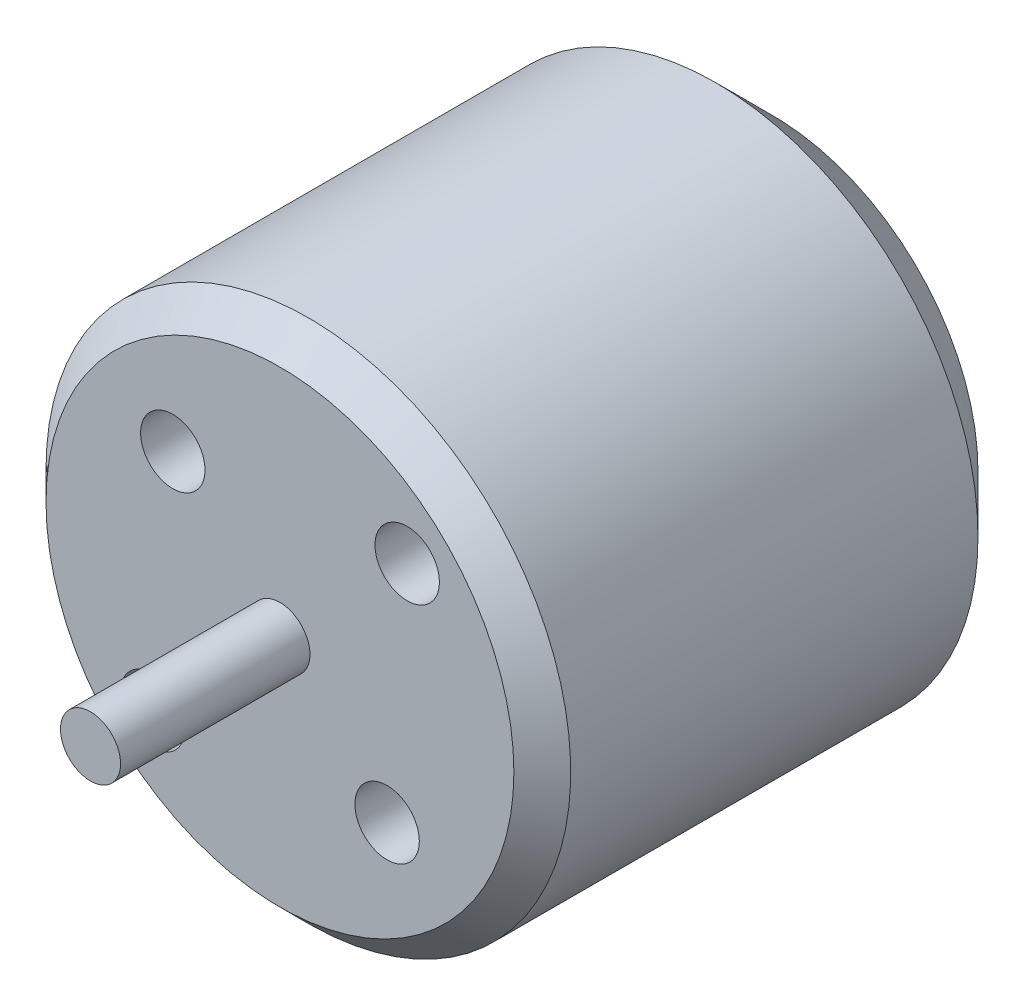
ISO-10303-21;
HEADER;
FILE_DESCRIPTION(('STEP AP214'),'2;1');
FILE_NAME('part.step','',(''),(''),'','','');
FILE_SCHEMA(('AUTOMOTIVE_DESIGN { 1 0 10303 214 1 1 1 1 }'));
ENDSEC;
DATA;
#1=APPLICATION_CONTEXT('core data for automotive mechanical design processes');
#2=APPLICATION_PROTOCOL_DEFINITION('international standard','automotive_design',2000,#1);
#3=PRODUCT_CONTEXT('',#1,'mechanical');
#4=PRODUCT('Part','Part','',(#3));
#5=PRODUCT_RELATED_PRODUCT_CATEGORY('part','',(#4));
#6=PRODUCT_DEFINITION_FORMATION('','',#4);
#7=PRODUCT_DEFINITION_CONTEXT('part definition',#1,'design');
#8=PRODUCT_DEFINITION('design','',#6,#7);
#9=PRODUCT_DEFINITION_SHAPE('','',#8);
#10=(LENGTH_UNIT() NAMED_UNIT(*) SI_UNIT(.MILLI.,.METRE.));
#11=(NAMED_UNIT(*) PLANE_ANGLE_UNIT() SI_UNIT($,.RADIAN.));
#12=(NAMED_UNIT(*) SI_UNIT($,.STERADIAN.) SOLID_ANGLE_UNIT());
#13=UNCERTAINTY_MEASURE_WITH_UNIT(LENGTH_MEASURE(1.E-05),#10,'distance_accuracy_value','');
#14=(GEOMETRIC_REPRESENTATION_CONTEXT(3) GLOBAL_UNCERTAINTY_ASSIGNED_CONTEXT((#13)) GLOBAL_UNIT_ASSIGNED_CONTEXT((#10,
#11,#12)) REPRESENTATION_CONTEXT('',''));
#15=CARTESIAN_POINT('',(0.,0.,0.));
#16=DIRECTION('',(0.,0.,1.));
#17=DIRECTION('',(1.,0.,0.));
#18=AXIS2_PLACEMENT_3D('',#15,#16,#17);
#19=CARTESIAN_POINT('',(0.,0.,26.));
#20=DIRECTION('',(0.,0.,-1.));
#21=DIRECTION('',(-1.,0.,0.));
#22=AXIS2_PLACEMENT_3D('',#19,#20,#21);
#23=CYLINDRICAL_SURFACE('',#22,13.85);
#24=CARTESIAN_POINT('',(0.,0.,3.00000000000001));
#25=DIRECTION('',(0.,0.,1.));
#26=DIRECTION('',(1.,0.,0.));
#27=AXIS2_PLACEMENT_3D('',#24,#25,#26);
#28=CIRCLE('',#27,13.85);
#29=CARTESIAN_POINT('',(-13.85,0.,3.00000000000001));
#30=VERTEX_POINT('',#29);
#31=EDGE_CURVE('E134',#30,#30,#28,.T.);
#32=CARTESIAN_POINT('',(0.,0.,24.5));
#33=DIRECTION('',(0.,0.,1.));
#34=DIRECTION('',(1.,0.,0.));
#35=AXIS2_PLACEMENT_3D('',#32,#33,#34);
#36=CIRCLE('',#35,13.85);
#37=CARTESIAN_POINT('',(-13.85,0.,24.5));
#38=VERTEX_POINT('',#37);
#39=EDGE_CURVE('E132',#38,#38,#36,.F.);
#40=CARTESIAN_POINT('',(-13.85,0.,3.00000000000001));
#41=CARTESIAN_POINT('',(-13.85,0.,3.22395833333334));
#42=CARTESIAN_POINT('',(-13.85,0.,3.44791666666668));
#43=CARTESIAN_POINT('',(-13.85,0.,3.89583333333335));
#44=CARTESIAN_POINT('',(-13.85,0.,4.11979166666668));
#45=CARTESIAN_POINT('',(-13.85,0.,4.56770833333334));
#46=CARTESIAN_POINT('',(-13.85,0.,4.79166666666668));
#47=CARTESIAN_POINT('',(-13.85,0.,5.23958333333335));
#48=CARTESIAN_POINT('',(-13.85,0.,5.46354166666668));
#49=CARTESIAN_POINT('',(-13.85,0.,5.91145833333335));
#50=CARTESIAN_POINT('',(-13.85,0.,6.13541666666668));
#51=CARTESIAN_POINT('',(-13.85,0.,6.58333333333335));
#52=CARTESIAN_POINT('',(-13.85,0.,6.80729166666668));
#53=CARTESIAN_POINT('',(-13.85,0.,7.25520833333335));
#54=CARTESIAN_POINT('',(-13.85,0.,7.47916666666668));
#55=CARTESIAN_POINT('',(-13.85,0.,7.92708333333335));
#56=CARTESIAN_POINT('',(-13.85,0.,8.15104166666669));
#57=CARTESIAN_POINT('',(-13.85,0.,8.59895833333335));
#58=CARTESIAN_POINT('',(-13.85,0.,8.82291666666668));
#59=CARTESIAN_POINT('',(-13.85,0.,9.27083333333335));
#60=CARTESIAN_POINT('',(-13.85,0.,9.49479166666668));
#61=CARTESIAN_POINT('',(-13.85,0.,9.94270833333335));
#62=CARTESIAN_POINT('',(-13.85,0.,10.1666666666667));
#63=CARTESIAN_POINT('',(-13.85,0.,10.6145833333334));
#64=CARTESIAN_POINT('',(-13.85,0.,10.8385416666667));
#65=CARTESIAN_POINT('',(-13.85,0.,11.2864583333334));
#66=CARTESIAN_POINT('',(-13.85,0.,11.5104166666667));
#67=CARTESIAN_POINT('',(-13.85,0.,11.9583333333334));
#68=CARTESIAN_POINT('',(-13.85,0.,12.1822916666667));
#69=CARTESIAN_POINT('',(-13.85,0.,12.6302083333334));
#70=CARTESIAN_POINT('',(-13.85,0.,12.8541666666667));
#71=CARTESIAN_POINT('',(-13.85,0.,13.3020833333334));
#72=CARTESIAN_POINT('',(-13.85,0.,13.5260416666667));
#73=CARTESIAN_POINT('',(-13.85,0.,13.9739583333334));
#74=CARTESIAN_POINT('',(-13.85,0.,14.1979166666667));
#75=CARTESIAN_POINT('',(-13.85,0.,14.6458333333334));
#76=CARTESIAN_POINT('',(-13.85,0.,14.8697916666667));
#77=CARTESIAN_POINT('',(-13.85,0.,15.3177083333334));
#78=CARTESIAN_POINT('',(-13.85,0.,15.5416666666667));
#79=CARTESIAN_POINT('',(-13.85,0.,15.9895833333334));
#80=CARTESIAN_POINT('',(-13.85,0.,16.2135416666667));
#81=CARTESIAN_POINT('',(-13.85,0.,16.6614583333334));
#82=CARTESIAN_POINT('',(-13.85,0.,16.8854166666667));
#83=CARTESIAN_POINT('',(-13.85,0.,17.3333333333334));
#84=CARTESIAN_POINT('',(-13.85,0.,17.5572916666667));
#85=CARTESIAN_POINT('',(-13.85,0.,18.0052083333334));
#86=CARTESIAN_POINT('',(-13.85,0.,18.2291666666667));
#87=CARTESIAN_POINT('',(-13.85,0.,18.6770833333334));
#88=CARTESIAN_POINT('',(-13.85,0.,18.9010416666667));
#89=CARTESIAN_POINT('',(-13.85,0.,19.3489583333334));
#90=CARTESIAN_POINT('',(-13.85,0.,19.5729166666667));
#91=CARTESIAN_POINT('',(-13.85,0.,20.0208333333334));
#92=CARTESIAN_POINT('',(-13.85,0.,20.2447916666667));
#93=CARTESIAN_POINT('',(-13.85,0.,20.6927083333334));
#94=CARTESIAN_POINT('',(-13.85,0.,20.9166666666667));
#95=CARTESIAN_POINT('',(-13.85,0.,21.3645833333334));
#96=CARTESIAN_POINT('',(-13.85,0.,21.5885416666667));
#97=CARTESIAN_POINT('',(-13.85,0.,22.0364583333334));
#98=CARTESIAN_POINT('',(-13.85,0.,22.2604166666667));
#99=CARTESIAN_POINT('',(-13.85,0.,22.7083333333334));
#100=CARTESIAN_POINT('',(-13.85,0.,22.9322916666667));
#101=CARTESIAN_POINT('',(-13.85,0.,23.3802083333334));
#102=CARTESIAN_POINT('',(-13.85,0.,23.6041666666667));
#103=CARTESIAN_POINT('',(-13.85,0.,24.0520833333334));
#104=CARTESIAN_POINT('',(-13.85,0.,24.2760416666667));
#105=CARTESIAN_POINT('',(-13.85,0.,24.5));
#106=B_SPLINE_CURVE_WITH_KNOTS('',3,(#40,#41,#42,#43,#44,#45,#46,#47,#48,#49,#50,#51,#52,#53,
#54,#55,#56,#57,#58,#59,#60,#61,#62,#63,#64,#65,#66,#67,#68,#69,#70,#71,#72,#73,#74,#75,#76,#77,
#78,#79,#80,#81,#82,#83,#84,#85,#86,#87,#88,#89,#90,#91,#92,#93,#94,#95,#96,#97,#98,#99,#100,
#101,#102,#103,#104,#105),.UNSPECIFIED.,.F.,.F.,(4,2,2,2,2,2,2,2,2,2,2,2,2,2,2,2,2,2,2,2,2,2,2,
2,2,2,2,2,2,2,2,2,4),(0.,0.671875000000002,1.34375,2.015625,2.6875,3.359375,4.03125000000001,
4.70312500000001,5.37500000000001,6.04687500000001,6.71875000000001,7.39062500000001,
8.06250000000001,8.73437500000001,9.40625000000001,10.078125,10.75,11.421875,12.09375,12.765625,
13.4375,14.109375,14.78125,15.453125,16.125,16.796875,17.46875,18.140625,18.8125,19.484375,
20.15625,20.828125,21.5),.UNSPECIFIED.);
#107=EDGE_CURVE('BSEAM37',#30,#38,#106,.T.);
#108=ORIENTED_EDGE('',*,*,#31,.T.);
#109=ORIENTED_EDGE('',*,*,#39,.T.);
#110=ORIENTED_EDGE('',*,*,#107,.T.);
#111=ORIENTED_EDGE('',*,*,#107,.F.);
#112=EDGE_LOOP('',(#108,#110,#109,#111));
#113=FACE_BOUND('',#112,.T.);
#114=ADVANCED_FACE('F37',(#113),#23,.T.);
#115=CARTESIAN_POINT('',(0.,0.,26.));
#116=DIRECTION('',(0.,0.,1.));
#117=DIRECTION('',(1.,0.,0.));
#118=AXIS2_PLACEMENT_3D('',#115,#116,#117);
#119=PLANE('',#118);
#120=CARTESIAN_POINT('',(-5.65685424949237,5.65685424949239,26.));
#121=DIRECTION('',(0.,0.,1.));
#122=DIRECTION('',(1.,0.,0.));
#123=AXIS2_PLACEMENT_3D('',#120,#121,#122);
#124=CIRCLE('',#123,1.69999999999999);
#125=CARTESIAN_POINT('',(-3.95685424949238,5.65685424949239,26.));
#126=VERTEX_POINT('',#125);
#127=EDGE_CURVE('E96',#126,#126,#124,.T.);
#128=ORIENTED_EDGE('',*,*,#127,.F.);
#129=EDGE_LOOP('',(#128));
#130=FACE_BOUND('',#129,.T.);
#131=CARTESIAN_POINT('',(6.71751442127221,6.71751442127219,26.));
#132=DIRECTION('',(0.,0.,1.));
#133=DIRECTION('',(1.,0.,0.));
#134=AXIS2_PLACEMENT_3D('',#131,#132,#133);
#135=CIRCLE('',#134,1.69999999999999);
#136=CARTESIAN_POINT('',(8.4175144212722,6.71751442127219,26.));
#137=VERTEX_POINT('',#136);
#138=EDGE_CURVE('E102',#137,#137,#135,.T.);
#139=ORIENTED_EDGE('',*,*,#138,.F.);
#140=EDGE_LOOP('',(#139));
#141=FACE_BOUND('',#140,.T.);
#142=CARTESIAN_POINT('',(5.65685424949237,-5.65685424949239,26.));
#143=DIRECTION('',(0.,0.,1.));
#144=DIRECTION('',(1.,0.,0.));
#145=AXIS2_PLACEMENT_3D('',#142,#143,#144);
#146=CIRCLE('',#145,1.69999999999999);
#147=CARTESIAN_POINT('',(7.35685424949236,-5.65685424949239,26.));
#148=VERTEX_POINT('',#147);
#149=EDGE_CURVE('E108',#148,#148,#146,.T.);
#150=ORIENTED_EDGE('',*,*,#149,.F.);
#151=EDGE_LOOP('',(#150));
#152=FACE_BOUND('',#151,.T.);
#153=CARTESIAN_POINT('',(-6.71751442127221,-6.71751442127219,26.));
#154=DIRECTION('',(0.,0.,1.));
#155=DIRECTION('',(1.,0.,0.));
#156=AXIS2_PLACEMENT_3D('',#153,#154,#155);
#157=CIRCLE('',#156,1.69999999999999);
#158=CARTESIAN_POINT('',(-5.01751442127222,-6.71751442127219,26.));
#159=VERTEX_POINT('',#158);
#160=EDGE_CURVE('E114',#159,#159,#157,.T.);
#161=ORIENTED_EDGE('',*,*,#160,.F.);
#162=EDGE_LOOP('',(#161));
#163=FACE_BOUND('',#162,.T.);
#164=CARTESIAN_POINT('',(0.,0.,26.));
#165=DIRECTION('',(0.,0.,1.));
#166=DIRECTION('',(1.,0.,0.));
#167=AXIS2_PLACEMENT_3D('',#164,#165,#166);
#168=CIRCLE('',#167,1.585);
#169=CARTESIAN_POINT('',(1.585,0.,26.));
#170=VERTEX_POINT('',#169);
#171=EDGE_CURVE('E120',#170,#170,#168,.T.);
#172=ORIENTED_EDGE('',*,*,#171,.F.);
#173=EDGE_LOOP('',(#172));
#174=FACE_BOUND('',#173,.T.);
#175=CARTESIAN_POINT('',(0.,0.,26.));
#176=DIRECTION('',(0.,0.,1.));
#177=DIRECTION('',(1.,0.,0.));
#178=AXIS2_PLACEMENT_3D('',#175,#176,#177);
#179=CIRCLE('',#178,12.35);
#180=CARTESIAN_POINT('',(-12.35,0.,26.));
#181=VERTEX_POINT('',#180);
#182=EDGE_CURVE('E128',#181,#181,#179,.T.);
#183=ORIENTED_EDGE('',*,*,#182,.T.);
#184=EDGE_LOOP('',(#183));
#185=FACE_BOUND('',#184,.T.);
#186=ADVANCED_FACE('F156',(#130,#141,#152,#163,#174,#185),#119,.T.);
#187=CARTESIAN_POINT('',(0.,0.,0.));
#188=DIRECTION('',(0.,0.,1.));
#189=DIRECTION('',(1.,0.,0.));
#190=AXIS2_PLACEMENT_3D('',#187,#188,#189);
#191=PLANE('',#190);
#192=CARTESIAN_POINT('',(0.,6.,0.));
#193=DIRECTION('',(0.,0.,-1.));
#194=DIRECTION('',(-1.,0.,0.));
#195=AXIS2_PLACEMENT_3D('',#192,#193,#194);
#196=CIRCLE('',#195,1.2);
#197=CARTESIAN_POINT('',(-1.2,6.,0.));
#198=VERTEX_POINT('',#197);
#199=EDGE_CURVE('E80',#198,#198,#196,.T.);
#200=ORIENTED_EDGE('',*,*,#199,.F.);
#201=EDGE_LOOP('',(#200));
#202=FACE_BOUND('',#201,.T.);
#203=CARTESIAN_POINT('',(-5.19615242270664,-2.99999999999999,0.));
#204=DIRECTION('',(0.,0.,-1.));
#205=DIRECTION('',(-1.,0.,0.));
#206=AXIS2_PLACEMENT_3D('',#203,#204,#205);
#207=CIRCLE('',#206,1.2);
#208=CARTESIAN_POINT('',(-6.39615242270664,-2.99999999999999,0.));
#209=VERTEX_POINT('',#208);
#210=EDGE_CURVE('E79',#209,#209,#207,.T.);
#211=ORIENTED_EDGE('',*,*,#210,.F.);
#212=EDGE_LOOP('',(#211));
#213=FACE_BOUND('',#212,.T.);
#214=CARTESIAN_POINT('',(5.19615242270664,-2.99999999999999,0.));
#215=DIRECTION('',(0.,0.,-1.));
#216=DIRECTION('',(-1.,0.,0.));
#217=AXIS2_PLACEMENT_3D('',#214,#215,#216);
#218=CIRCLE('',#217,1.2);
#219=CARTESIAN_POINT('',(3.99615242270664,-2.99999999999999,0.));
#220=VERTEX_POINT('',#219);
#221=EDGE_CURVE('E90',#220,#220,#218,.T.);
#222=ORIENTED_EDGE('',*,*,#221,.F.);
#223=EDGE_LOOP('',(#222));
#224=FACE_BOUND('',#223,.T.);
#225=CARTESIAN_POINT('',(0.,0.,0.));
#226=DIRECTION('',(0.,0.,-1.));
#227=DIRECTION('',(-1.,0.,0.));
#228=AXIS2_PLACEMENT_3D('',#225,#226,#227);
#229=CIRCLE('',#228,4.5);
#230=CARTESIAN_POINT('',(-4.5,0.,0.));
#231=VERTEX_POINT('',#230);
#232=EDGE_CURVE('E11',#231,#231,#229,.T.);
#233=ORIENTED_EDGE('',*,*,#232,.F.);
#234=EDGE_LOOP('',(#233));
#235=FACE_BOUND('',#234,.T.);
#236=CARTESIAN_POINT('',(0.,0.,0.));
#237=DIRECTION('',(0.,0.,1.));
#238=DIRECTION('',(1.,0.,0.));
#239=AXIS2_PLACEMENT_3D('',#236,#237,#238);
#240=CIRCLE('',#239,10.85);
#241=CARTESIAN_POINT('',(10.85,0.,0.));
#242=VERTEX_POINT('',#241);
#243=EDGE_CURVE('E42',#242,#242,#240,.F.);
#244=ORIENTED_EDGE('',*,*,#243,.T.);
#245=EDGE_LOOP('',(#244));
#246=FACE_BOUND('',#245,.T.);
#247=ADVANCED_FACE('F141',(#202,#213,#224,#235,#246),#191,.F.);
#248=CARTESIAN_POINT('',(0.,0.,26.));
#249=DIRECTION('',(0.,0.,-1.));
#250=DIRECTION('',(-1.,0.,0.));
#251=AXIS2_PLACEMENT_3D('',#248,#249,#250);
#252=CONICAL_SURFACE('',#251,12.35,0.785398163397449);
#253=CARTESIAN_POINT('',(-13.85,0.,24.5));
#254=CARTESIAN_POINT('',(-13.834375,0.,24.515625));
#255=CARTESIAN_POINT('',(-13.81875,0.,24.53125));
#256=CARTESIAN_POINT('',(-13.7875,0.,24.5625));
#257=CARTESIAN_POINT('',(-13.771875,0.,24.578125));
#258=CARTESIAN_POINT('',(-13.740625,0.,24.609375));
#259=CARTESIAN_POINT('',(-13.725,0.,24.625));
#260=CARTESIAN_POINT('',(-13.69375,0.,24.65625));
#261=CARTESIAN_POINT('',(-13.678125,0.,24.671875));
#262=CARTESIAN_POINT('',(-13.646875,0.,24.703125));
#263=CARTESIAN_POINT('',(-13.63125,0.,24.71875));
#264=CARTESIAN_POINT('',(-13.6,0.,24.75));
#265=CARTESIAN_POINT('',(-13.584375,0.,24.765625));
#266=CARTESIAN_POINT('',(-13.553125,0.,24.796875));
#267=CARTESIAN_POINT('',(-13.5375,0.,24.8125));
#268=CARTESIAN_POINT('',(-13.50625,0.,24.84375));
#269=CARTESIAN_POINT('',(-13.490625,0.,24.859375));
#270=CARTESIAN_POINT('',(-13.459375,0.,24.890625));
#271=CARTESIAN_POINT('',(-13.44375,0.,24.90625));
#272=CARTESIAN_POINT('',(-13.4125,0.,24.9375));
#273=CARTESIAN_POINT('',(-13.396875,0.,24.953125));
#274=CARTESIAN_POINT('',(-13.365625,0.,24.984375));
#275=CARTESIAN_POINT('',(-13.35,0.,25.));
#276=CARTESIAN_POINT('',(-13.31875,0.,25.03125));
#277=CARTESIAN_POINT('',(-13.303125,0.,25.046875));
#278=CARTESIAN_POINT('',(-13.271875,0.,25.078125));
#279=CARTESIAN_POINT('',(-13.25625,0.,25.09375));
#280=CARTESIAN_POINT('',(-13.225,0.,25.125));
#281=CARTESIAN_POINT('',(-13.209375,0.,25.140625));
#282=CARTESIAN_POINT('',(-13.178125,0.,25.171875));
#283=CARTESIAN_POINT('',(-13.1625,0.,25.1875));
#284=CARTESIAN_POINT('',(-13.13125,0.,25.21875));
#285=CARTESIAN_POINT('',(-13.115625,0.,25.234375));
#286=CARTESIAN_POINT('',(-13.084375,0.,25.265625));
#287=CARTESIAN_POINT('',(-13.06875,0.,25.28125));
#288=CARTESIAN_POINT('',(-13.0375,0.,25.3125));
#289=CARTESIAN_POINT('',(-13.021875,0.,25.328125));
#290=CARTESIAN_POINT('',(-12.990625,0.,25.359375));
#291=CARTESIAN_POINT('',(-12.975,0.,25.375));
#292=CARTESIAN_POINT('',(-12.94375,0.,25.40625));
#293=CARTESIAN_POINT('',(-12.928125,0.,25.421875));
#294=CARTESIAN_POINT('',(-12.896875,0.,25.453125));
#295=CARTESIAN_POINT('',(-12.88125,0.,25.46875));
#296=CARTESIAN_POINT('',(-12.85,0.,25.5));
#297=CARTESIAN_POINT('',(-12.834375,0.,25.515625));
#298=CARTESIAN_POINT('',(-12.803125,0.,25.546875));
#299=CARTESIAN_POINT('',(-12.7875,0.,25.5625));
#300=CARTESIAN_POINT('',(-12.75625,0.,25.59375));
#301=CARTESIAN_POINT('',(-12.740625,0.,25.609375));
#302=CARTESIAN_POINT('',(-12.709375,0.,25.640625));
#303=CARTESIAN_POINT('',(-12.69375,0.,25.65625));
#304=CARTESIAN_POINT('',(-12.6625,0.,25.6875));
#305=CARTESIAN_POINT('',(-12.646875,0.,25.703125));
#306=CARTESIAN_POINT('',(-12.615625,0.,25.734375));
#307=CARTESIAN_POINT('',(-12.6,0.,25.75));
#308=CARTESIAN_POINT('',(-12.56875,0.,25.78125));
#309=CARTESIAN_POINT('',(-12.553125,0.,25.796875));
#310=CARTESIAN_POINT('',(-12.521875,0.,25.828125));
#311=CARTESIAN_POINT('',(-12.50625,0.,25.84375));
#312=CARTESIAN_POINT('',(-12.475,0.,25.875));
#313=CARTESIAN_POINT('',(-12.459375,0.,25.890625));
#314=CARTESIAN_POINT('',(-12.428125,0.,25.921875));
#315=CARTESIAN_POINT('',(-12.4125,0.,25.9375));
#316=CARTESIAN_POINT('',(-12.38125,0.,25.96875));
#317=CARTESIAN_POINT('',(-12.365625,0.,25.984375));
#318=CARTESIAN_POINT('',(-12.35,0.,26.));
#319=B_SPLINE_CURVE_WITH_KNOTS('',3,(#253,#254,#255,#256,#257,#258,#259,#260,#261,#262,#263,
#264,#265,#266,#267,#268,#269,#270,#271,#272,#273,#274,#275,#276,#277,#278,#279,#280,#281,#282,
#283,#284,#285,#286,#287,#288,#289,#290,#291,#292,#293,#294,#295,#296,#297,#298,#299,#300,#301,
#302,#303,#304,#305,#306,#307,#308,#309,#310,#311,#312,#313,#314,#315,#316,#317,#318),
.UNSPECIFIED.,.F.,.F.,(4,2,2,2,2,2,2,2,2,2,2,2,2,2,2,2,2,2,2,2,2,2,2,2,2,2,2,2,2,2,2,2,4),(0.,
0.0662912607362389,0.132582521472475,0.198873782208713,0.265165042944949,0.331456303681186,
0.397747564417424,0.46403882515366,0.530330085889896,0.596621346626133,0.662912607362369,
0.729203868098609,0.795495128834846,0.861786389571082,0.928077650307319,0.994368911043556,
1.06066017177979,1.12695143251603,1.19324269325227,1.2595339539885,1.32582521472474,
1.39211647546098,1.45840773619721,1.52469899693345,1.59099025766969,1.65728151840593,
1.72357277914216,1.7898640398784,1.85615530061464,1.92244656135087,1.98873782208711,
2.05502908282335,2.12132034355959),.UNSPECIFIED.);
#320=EDGE_CURVE('BSEAM146',#38,#181,#319,.T.);
#321=ORIENTED_EDGE('',*,*,#39,.F.);
#322=ORIENTED_EDGE('',*,*,#182,.F.);
#323=ORIENTED_EDGE('',*,*,#320,.T.);
#324=ORIENTED_EDGE('',*,*,#320,.F.);
#325=EDGE_LOOP('',(#321,#323,#322,#324));
#326=FACE_BOUND('',#325,.T.);
#327=ADVANCED_FACE('F146',(#326),#252,.T.);
#328=CARTESIAN_POINT('',(0.,0.,3.00000000000001));
#329=DIRECTION('',(0.,0.,1.));
#330=DIRECTION('',(1.,0.,0.));
#331=AXIS2_PLACEMENT_3D('',#328,#329,#330);
#332=CONICAL_SURFACE('',#331,13.85,0.785398163397451);
#333=ORIENTED_EDGE('',*,*,#243,.F.);
#334=EDGE_LOOP('',(#333));
#335=FACE_BOUND('',#334,.T.);
#336=ORIENTED_EDGE('',*,*,#31,.F.);
#337=EDGE_LOOP('',(#336));
#338=FACE_BOUND('',#337,.T.);
#339=ADVANCED_FACE('F40',(#335,#338),#332,.T.);
#340=CARTESIAN_POINT('',(0.,0.,-4.));
#341=DIRECTION('',(0.,0.,1.));
#342=DIRECTION('',(1.,0.,0.));
#343=AXIS2_PLACEMENT_3D('',#340,#341,#342);
#344=CYLINDRICAL_SURFACE('',#343,4.5);
#345=CARTESIAN_POINT('',(0.,0.,-4.));
#346=DIRECTION('',(0.,0.,-1.));
#347=DIRECTION('',(-1.,0.,0.));
#348=AXIS2_PLACEMENT_3D('',#345,#346,#347);
#349=CIRCLE('',#348,4.5);
#350=CARTESIAN_POINT('',(-4.5,0.,-4.));
#351=VERTEX_POINT('',#350);
#352=EDGE_CURVE('E124',#351,#351,#349,.T.);
#353=ORIENTED_EDGE('',*,*,#352,.F.);
#354=EDGE_LOOP('',(#353));
#355=FACE_BOUND('',#354,.T.);
#356=ORIENTED_EDGE('',*,*,#232,.T.);
#357=EDGE_LOOP('',(#356));
#358=FACE_BOUND('',#357,.T.);
#359=ADVANCED_FACE('F145',(#355,#358),#344,.T.);
#360=CARTESIAN_POINT('',(0.,0.,-4.));
#361=DIRECTION('',(0.,0.,-1.));
#362=DIRECTION('',(-1.,0.,0.));
#363=AXIS2_PLACEMENT_3D('',#360,#361,#362);
#364=PLANE('',#363);
#365=ORIENTED_EDGE('',*,*,#352,.T.);
#366=EDGE_LOOP('',(#365));
#367=FACE_BOUND('',#366,.T.);
#368=ADVANCED_FACE('F151',(#367),#364,.T.);
#369=CARTESIAN_POINT('',(0.,0.,36.));
#370=DIRECTION('',(0.,0.,-1.));
#371=DIRECTION('',(-1.,0.,0.));
#372=AXIS2_PLACEMENT_3D('',#369,#370,#371);
#373=CYLINDRICAL_SURFACE('',#372,1.585);
#374=CARTESIAN_POINT('',(0.,0.,36.));
#375=DIRECTION('',(0.,0.,1.));
#376=DIRECTION('',(1.,0.,0.));
#377=AXIS2_PLACEMENT_3D('',#374,#375,#376);
#378=CIRCLE('',#377,1.585);
#379=CARTESIAN_POINT('',(1.585,0.,36.));
#380=VERTEX_POINT('',#379);
#381=EDGE_CURVE('E121',#380,#380,#378,.T.);
#382=ORIENTED_EDGE('',*,*,#381,.F.);
#383=EDGE_LOOP('',(#382));
#384=FACE_BOUND('',#383,.T.);
#385=ORIENTED_EDGE('',*,*,#171,.T.);
#386=EDGE_LOOP('',(#385));
#387=FACE_BOUND('',#386,.T.);
#388=ADVANCED_FACE('F175',(#384,#387),#373,.T.);
#389=CARTESIAN_POINT('',(0.,0.,36.));
#390=DIRECTION('',(0.,0.,1.));
#391=DIRECTION('',(1.,0.,0.));
#392=AXIS2_PLACEMENT_3D('',#389,#390,#391);
#393=PLANE('',#392);
#394=ORIENTED_EDGE('',*,*,#381,.T.);
#395=EDGE_LOOP('',(#394));
#396=FACE_BOUND('',#395,.T.);
#397=ADVANCED_FACE('F179',(#396),#393,.T.);
#398=CARTESIAN_POINT('',(-6.71751442127221,-6.71751442127219,16.));
#399=DIRECTION('',(0.,0.,1.));
#400=DIRECTION('',(1.,0.,0.));
#401=AXIS2_PLACEMENT_3D('',#398,#399,#400);
#402=CONICAL_SURFACE('',#401,1.7,1.02974425867665);
#403=CARTESIAN_POINT('',(-6.71751442127222,-6.71751442127219,14.9785369476531));
#404=VERTEX_POINT('',#403);
#405=VERTEX_LOOP('',#404);
#406=FACE_BOUND('',#405,.T.);
#407=CARTESIAN_POINT('',(-6.71751442127221,-6.71751442127219,16.));
#408=DIRECTION('',(0.,0.,1.));
#409=DIRECTION('',(1.,0.,0.));
#410=AXIS2_PLACEMENT_3D('',#407,#408,#409);
#411=CIRCLE('',#410,1.7);
#412=CARTESIAN_POINT('',(-5.01751442127222,-6.71751442127219,16.));
#413=VERTEX_POINT('',#412);
#414=EDGE_CURVE('E117',#413,#413,#411,.T.);
#415=ORIENTED_EDGE('',*,*,#414,.T.);
#416=EDGE_LOOP('',(#415));
#417=FACE_BOUND('',#416,.T.);
#418=ADVANCED_FACE('F183',(#406,#417),#402,.F.);
#419=CARTESIAN_POINT('',(-6.71751442127221,-6.71751442127219,26.));
#420=DIRECTION('',(0.,0.,1.));
#421=DIRECTION('',(1.,0.,0.));
#422=AXIS2_PLACEMENT_3D('',#419,#420,#421);
#423=CYLINDRICAL_SURFACE('',#422,1.69999999999999);
#424=ORIENTED_EDGE('',*,*,#414,.F.);
#425=EDGE_LOOP('',(#424));
#426=FACE_BOUND('',#425,.T.);
#427=ORIENTED_EDGE('',*,*,#160,.T.);
#428=EDGE_LOOP('',(#427));
#429=FACE_BOUND('',#428,.T.);
#430=ADVANCED_FACE('F187',(#426,#429),#423,.F.);
#431=CARTESIAN_POINT('',(5.65685424949237,-5.65685424949239,16.));
#432=DIRECTION('',(0.,0.,1.));
#433=DIRECTION('',(1.,0.,0.));
#434=AXIS2_PLACEMENT_3D('',#431,#432,#433);
#435=CONICAL_SURFACE('',#434,1.7,1.02974425867665);
#436=CARTESIAN_POINT('',(5.65685424949237,-5.65685424949239,14.9785369476531));
#437=VERTEX_POINT('',#436);
#438=VERTEX_LOOP('',#437);
#439=FACE_BOUND('',#438,.T.);
#440=CARTESIAN_POINT('',(5.65685424949237,-5.65685424949239,16.));
#441=DIRECTION('',(0.,0.,1.));
#442=DIRECTION('',(1.,0.,0.));
#443=AXIS2_PLACEMENT_3D('',#440,#441,#442);
#444=CIRCLE('',#443,1.7);
#445=CARTESIAN_POINT('',(7.35685424949237,-5.65685424949239,16.));
#446=VERTEX_POINT('',#445);
#447=EDGE_CURVE('E111',#446,#446,#444,.T.);
#448=ORIENTED_EDGE('',*,*,#447,.T.);
#449=EDGE_LOOP('',(#448));
#450=FACE_BOUND('',#449,.T.);
#451=ADVANCED_FACE('F190',(#439,#450),#435,.F.);
#452=CARTESIAN_POINT('',(5.65685424949237,-5.65685424949239,26.));
#453=DIRECTION('',(0.,0.,1.));
#454=DIRECTION('',(1.,0.,0.));
#455=AXIS2_PLACEMENT_3D('',#452,#453,#454);
#456=CYLINDRICAL_SURFACE('',#455,1.69999999999999);
#457=ORIENTED_EDGE('',*,*,#447,.F.);
#458=EDGE_LOOP('',(#457));
#459=FACE_BOUND('',#458,.T.);
#460=ORIENTED_EDGE('',*,*,#149,.T.);
#461=EDGE_LOOP('',(#460));
#462=FACE_BOUND('',#461,.T.);
#463=ADVANCED_FACE('F194',(#459,#462),#456,.F.);
#464=CARTESIAN_POINT('',(6.71751442127221,6.71751442127219,16.));
#465=DIRECTION('',(0.,0.,1.));
#466=DIRECTION('',(1.,0.,0.));
#467=AXIS2_PLACEMENT_3D('',#464,#465,#466);
#468=CONICAL_SURFACE('',#467,1.7,1.02974425867665);
#469=CARTESIAN_POINT('',(6.71751442127221,6.71751442127219,14.9785369476531));
#470=VERTEX_POINT('',#469);
#471=VERTEX_LOOP('',#470);
#472=FACE_BOUND('',#471,.T.);
#473=CARTESIAN_POINT('',(6.71751442127221,6.71751442127219,16.));
#474=DIRECTION('',(0.,0.,1.));
#475=DIRECTION('',(1.,0.,0.));
#476=AXIS2_PLACEMENT_3D('',#473,#474,#475);
#477=CIRCLE('',#476,1.7);
#478=CARTESIAN_POINT('',(8.41751442127221,6.71751442127219,16.));
#479=VERTEX_POINT('',#478);
#480=EDGE_CURVE('E105',#479,#479,#477,.T.);
#481=ORIENTED_EDGE('',*,*,#480,.T.);
#482=EDGE_LOOP('',(#481));
#483=FACE_BOUND('',#482,.T.);
#484=ADVANCED_FACE('F197',(#472,#483),#468,.F.);
#485=CARTESIAN_POINT('',(6.71751442127221,6.71751442127219,26.));
#486=DIRECTION('',(0.,0.,1.));
#487=DIRECTION('',(1.,0.,0.));
#488=AXIS2_PLACEMENT_3D('',#485,#486,#487);
#489=CYLINDRICAL_SURFACE('',#488,1.69999999999999);
#490=ORIENTED_EDGE('',*,*,#480,.F.);
#491=EDGE_LOOP('',(#490));
#492=FACE_BOUND('',#491,.T.);
#493=ORIENTED_EDGE('',*,*,#138,.T.);
#494=EDGE_LOOP('',(#493));
#495=FACE_BOUND('',#494,.T.);
#496=ADVANCED_FACE('F201',(#492,#495),#489,.F.);
#497=CARTESIAN_POINT('',(-5.65685424949237,5.65685424949239,16.));
#498=DIRECTION('',(0.,0.,1.));
#499=DIRECTION('',(1.,0.,0.));
#500=AXIS2_PLACEMENT_3D('',#497,#498,#499);
#501=CONICAL_SURFACE('',#500,1.7,1.02974425867665);
#502=CARTESIAN_POINT('',(-5.65685424949238,5.65685424949239,14.9785369476531));
#503=VERTEX_POINT('',#502);
#504=VERTEX_LOOP('',#503);
#505=FACE_BOUND('',#504,.T.);
#506=CARTESIAN_POINT('',(-5.65685424949237,5.65685424949239,16.));
#507=DIRECTION('',(0.,0.,1.));
#508=DIRECTION('',(1.,0.,0.));
#509=AXIS2_PLACEMENT_3D('',#506,#507,#508);
#510=CIRCLE('',#509,1.7);
#511=CARTESIAN_POINT('',(-3.95685424949238,5.65685424949239,16.));
#512=VERTEX_POINT('',#511);
#513=EDGE_CURVE('E99',#512,#512,#510,.T.);
#514=ORIENTED_EDGE('',*,*,#513,.T.);
#515=EDGE_LOOP('',(#514));
#516=FACE_BOUND('',#515,.T.);
#517=ADVANCED_FACE('F205',(#505,#516),#501,.F.);
#518=CARTESIAN_POINT('',(-5.65685424949237,5.65685424949239,26.));
#519=DIRECTION('',(0.,0.,1.));
#520=DIRECTION('',(1.,0.,0.));
#521=AXIS2_PLACEMENT_3D('',#518,#519,#520);
#522=CYLINDRICAL_SURFACE('',#521,1.69999999999999);
#523=ORIENTED_EDGE('',*,*,#513,.F.);
#524=EDGE_LOOP('',(#523));
#525=FACE_BOUND('',#524,.T.);
#526=ORIENTED_EDGE('',*,*,#127,.T.);
#527=EDGE_LOOP('',(#526));
#528=FACE_BOUND('',#527,.T.);
#529=ADVANCED_FACE('F209',(#525,#528),#522,.F.);
#530=CARTESIAN_POINT('',(5.19615242270664,-2.99999999999999,10.));
#531=DIRECTION('',(0.,0.,-1.));
#532=DIRECTION('',(-1.,0.,0.));
#533=AXIS2_PLACEMENT_3D('',#530,#531,#532);
#534=CONICAL_SURFACE('',#533,1.2,1.02974425867665);
#535=CARTESIAN_POINT('',(5.19615242270664,-2.99999999999999,10.7210327428331));
#536=VERTEX_POINT('',#535);
#537=VERTEX_LOOP('',#536);
#538=FACE_BOUND('',#537,.T.);
#539=CARTESIAN_POINT('',(5.19615242270664,-2.99999999999999,10.));
#540=DIRECTION('',(0.,0.,-1.));
#541=DIRECTION('',(-1.,0.,0.));
#542=AXIS2_PLACEMENT_3D('',#539,#540,#541);
#543=CIRCLE('',#542,1.2);
#544=CARTESIAN_POINT('',(3.99615242270664,-2.99999999999999,10.));
#545=VERTEX_POINT('',#544);
#546=EDGE_CURVE('E93',#545,#545,#543,.T.);
#547=ORIENTED_EDGE('',*,*,#546,.T.);
#548=EDGE_LOOP('',(#547));
#549=FACE_BOUND('',#548,.T.);
#550=ADVANCED_FACE('F213',(#538,#549),#534,.F.);
#551=CARTESIAN_POINT('',(5.19615242270664,-2.99999999999999,0.));
#552=DIRECTION('',(0.,0.,-1.));
#553=DIRECTION('',(-1.,0.,0.));
#554=AXIS2_PLACEMENT_3D('',#551,#552,#553);
#555=CYLINDRICAL_SURFACE('',#554,1.2);
#556=ORIENTED_EDGE('',*,*,#546,.F.);
#557=EDGE_LOOP('',(#556));
#558=FACE_BOUND('',#557,.T.);
#559=ORIENTED_EDGE('',*,*,#221,.T.);
#560=EDGE_LOOP('',(#559));
#561=FACE_BOUND('',#560,.T.);
#562=ADVANCED_FACE('F217',(#558,#561),#555,.F.);
#563=CARTESIAN_POINT('',(-5.19615242270664,-2.99999999999999,10.));
#564=DIRECTION('',(0.,0.,-1.));
#565=DIRECTION('',(-1.,0.,0.));
#566=AXIS2_PLACEMENT_3D('',#563,#564,#565);
#567=CONICAL_SURFACE('',#566,1.2,1.02974425867665);
#568=CARTESIAN_POINT('',(-5.19615242270664,-2.99999999999999,10.7210327428331));
#569=VERTEX_POINT('',#568);
#570=VERTEX_LOOP('',#569);
#571=FACE_BOUND('',#570,.T.);
#572=CARTESIAN_POINT('',(-5.19615242270664,-2.99999999999999,10.));
#573=DIRECTION('',(0.,0.,-1.));
#574=DIRECTION('',(-1.,0.,0.));
#575=AXIS2_PLACEMENT_3D('',#572,#573,#574);
#576=CIRCLE('',#575,1.2);
#577=CARTESIAN_POINT('',(-6.39615242270664,-2.99999999999999,10.));
#578=VERTEX_POINT('',#577);
#579=EDGE_CURVE('E83',#578,#578,#576,.T.);
#580=ORIENTED_EDGE('',*,*,#579,.T.);
#581=EDGE_LOOP('',(#580));
#582=FACE_BOUND('',#581,.T.);
#583=ADVANCED_FACE('F221',(#571,#582),#567,.F.);
#584=CARTESIAN_POINT('',(-5.19615242270664,-2.99999999999999,0.));
#585=DIRECTION('',(0.,0.,-1.));
#586=DIRECTION('',(-1.,0.,0.));
#587=AXIS2_PLACEMENT_3D('',#584,#585,#586);
#588=CYLINDRICAL_SURFACE('',#587,1.2);
#589=ORIENTED_EDGE('',*,*,#579,.F.);
#590=EDGE_LOOP('',(#589));
#591=FACE_BOUND('',#590,.T.);
#592=ORIENTED_EDGE('',*,*,#210,.T.);
#593=EDGE_LOOP('',(#592));
#594=FACE_BOUND('',#593,.T.);
#595=ADVANCED_FACE('F73',(#591,#594),#588,.F.);
#596=CARTESIAN_POINT('',(0.,6.,10.));
#597=DIRECTION('',(0.,0.,-1.));
#598=DIRECTION('',(-1.,0.,0.));
#599=AXIS2_PLACEMENT_3D('',#596,#597,#598);
#600=CONICAL_SURFACE('',#599,1.2,1.02974425867665);
#601=CARTESIAN_POINT('',(0.,6.,10.7210327428331));
#602=VERTEX_POINT('',#601);
#603=VERTEX_LOOP('',#602);
#604=FACE_BOUND('',#603,.T.);
#605=CARTESIAN_POINT('',(0.,6.,10.));
#606=DIRECTION('',(0.,0.,-1.));
#607=DIRECTION('',(-1.,0.,0.));
#608=AXIS2_PLACEMENT_3D('',#605,#606,#607);
#609=CIRCLE('',#608,1.2);
#610=CARTESIAN_POINT('',(-1.2,6.,10.));
#611=VERTEX_POINT('',#610);
#612=EDGE_CURVE('E77',#611,#611,#609,.T.);
#613=ORIENTED_EDGE('',*,*,#612,.T.);
#614=EDGE_LOOP('',(#613));
#615=FACE_BOUND('',#614,.T.);
#616=ADVANCED_FACE('F69',(#604,#615),#600,.F.);
#617=CARTESIAN_POINT('',(0.,6.,0.));
#618=DIRECTION('',(0.,0.,-1.));
#619=DIRECTION('',(-1.,0.,0.));
#620=AXIS2_PLACEMENT_3D('',#617,#618,#619);
#621=CYLINDRICAL_SURFACE('',#620,1.2);
#622=ORIENTED_EDGE('',*,*,#612,.F.);
#623=EDGE_LOOP('',(#622));
#624=FACE_BOUND('',#623,.T.);
#625=ORIENTED_EDGE('',*,*,#199,.T.);
#626=EDGE_LOOP('',(#625));
#627=FACE_BOUND('',#626,.T.);
#628=ADVANCED_FACE('F72',(#624,#627),#621,.F.);
#629=CLOSED_SHELL('',(#114,#186,#247,#327,#339,#359,#368,#388,#397,#418,#430,#451,#463,#484,
#496,#517,#529,#550,#562,#583,#595,#616,#628));
#630=MANIFOLD_SOLID_BREP('B2',#629);
#631=ADVANCED_BREP_SHAPE_REPRESENTATION('',(#18,#630),#14);
#632=SHAPE_DEFINITION_REPRESENTATION(#9,#631);
ENDSEC;
END-ISO-10303-21;
